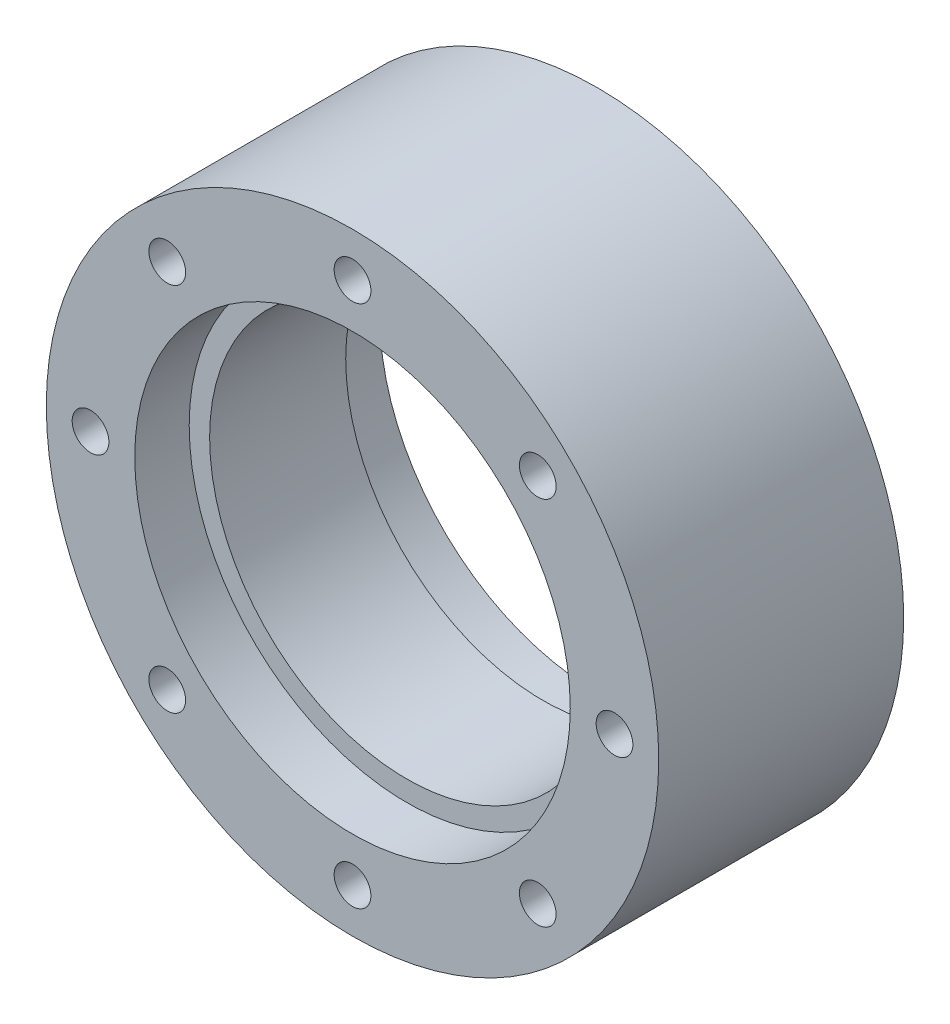
ISO-10303-21;
HEADER;
FILE_DESCRIPTION(('STEP AP214'),'2;1');
FILE_NAME('part.step','',(''),(''),'','','');
FILE_SCHEMA(('AUTOMOTIVE_DESIGN { 1 0 10303 214 1 1 1 1 }'));
ENDSEC;
DATA;
#1=APPLICATION_CONTEXT('core data for automotive mechanical design processes');
#2=APPLICATION_PROTOCOL_DEFINITION('international standard','automotive_design',2000,#1);
#3=PRODUCT_CONTEXT('',#1,'mechanical');
#4=PRODUCT('Part','Part','',(#3));
#5=PRODUCT_RELATED_PRODUCT_CATEGORY('part','',(#4));
#6=PRODUCT_DEFINITION_FORMATION('','',#4);
#7=PRODUCT_DEFINITION_CONTEXT('part definition',#1,'design');
#8=PRODUCT_DEFINITION('design','',#6,#7);
#9=PRODUCT_DEFINITION_SHAPE('','',#8);
#10=(LENGTH_UNIT() NAMED_UNIT(*) SI_UNIT(.MILLI.,.METRE.));
#11=(NAMED_UNIT(*) PLANE_ANGLE_UNIT() SI_UNIT($,.RADIAN.));
#12=(NAMED_UNIT(*) SI_UNIT($,.STERADIAN.) SOLID_ANGLE_UNIT());
#13=UNCERTAINTY_MEASURE_WITH_UNIT(LENGTH_MEASURE(1.E-05),#10,'distance_accuracy_value','');
#14=(GEOMETRIC_REPRESENTATION_CONTEXT(3) GLOBAL_UNCERTAINTY_ASSIGNED_CONTEXT((#13)) GLOBAL_UNIT_ASSIGNED_CONTEXT((#10,
#11,#12)) REPRESENTATION_CONTEXT('',''));
#15=CARTESIAN_POINT('',(0.,0.,0.));
#16=DIRECTION('',(0.,0.,1.));
#17=DIRECTION('',(1.,0.,0.));
#18=AXIS2_PLACEMENT_3D('',#15,#16,#17);
#19=CARTESIAN_POINT('',(0.,19.25,-9.));
#20=DIRECTION('',(0.,0.,1.));
#21=DIRECTION('',(1.,0.,0.));
#22=AXIS2_PLACEMENT_3D('',#19,#20,#21);
#23=CYLINDRICAL_SURFACE('',#22,1.35);
#24=CARTESIAN_POINT('',(0.,19.25,-6.40000000000001));
#25=DIRECTION('',(0.,0.,-1.));
#26=DIRECTION('',(-1.,0.,0.));
#27=AXIS2_PLACEMENT_3D('',#24,#25,#26);
#28=CIRCLE('',#27,1.35);
#29=CARTESIAN_POINT('',(-1.35,19.25,-6.40000000000001));
#30=VERTEX_POINT('',#29);
#31=EDGE_CURVE('E10',#30,#30,#28,.T.);
#32=ORIENTED_EDGE('',*,*,#31,.T.);
#33=EDGE_LOOP('',(#32));
#34=FACE_BOUND('',#33,.T.);
#35=CARTESIAN_POINT('',(0.,19.25,9.00000000000001));
#36=DIRECTION('',(0.,0.,1.));
#37=DIRECTION('',(1.,0.,0.));
#38=AXIS2_PLACEMENT_3D('',#35,#36,#37);
#39=CIRCLE('',#38,1.35);
#40=CARTESIAN_POINT('',(1.35,19.25,9.00000000000001));
#41=VERTEX_POINT('',#40);
#42=EDGE_CURVE('E93',#41,#41,#39,.T.);
#43=ORIENTED_EDGE('',*,*,#42,.T.);
#44=EDGE_LOOP('',(#43));
#45=FACE_BOUND('',#44,.T.);
#46=ADVANCED_FACE('F41',(#34,#45),#23,.F.);
#47=CARTESIAN_POINT('',(16.,0.,-9.));
#48=DIRECTION('',(0.,0.,-1.));
#49=DIRECTION('',(-1.,0.,0.));
#50=AXIS2_PLACEMENT_3D('',#47,#48,#49);
#51=PLANE('',#50);
#52=CARTESIAN_POINT('',(13.611805537841,-13.6118055378411,-9.));
#53=DIRECTION('',(0.,0.,1.));
#54=DIRECTION('',(-0.707106781186551,-0.707106781186544,0.));
#55=AXIS2_PLACEMENT_3D('',#52,#53,#54);
#56=CIRCLE('',#55,1.35);
#57=CARTESIAN_POINT('',(12.6572113832391,-14.5663996924429,-9.));
#58=VERTEX_POINT('',#57);
#59=EDGE_CURVE('E369',#58,#58,#56,.T.);
#60=ORIENTED_EDGE('',*,*,#59,.T.);
#61=EDGE_LOOP('',(#60));
#62=FACE_BOUND('',#61,.T.);
#63=CARTESIAN_POINT('',(-13.6118055378412,-13.6118055378409,-9.));
#64=DIRECTION('',(0.,0.,1.));
#65=DIRECTION('',(-0.707106781186541,0.707106781186554,0.));
#66=AXIS2_PLACEMENT_3D('',#63,#64,#65);
#67=CIRCLE('',#66,1.35);
#68=CARTESIAN_POINT('',(-14.566399692443,-12.6572113832391,-9.));
#69=VERTEX_POINT('',#68);
#70=EDGE_CURVE('E379',#69,#69,#67,.T.);
#71=ORIENTED_EDGE('',*,*,#70,.T.);
#72=EDGE_LOOP('',(#71));
#73=FACE_BOUND('',#72,.T.);
#74=CARTESIAN_POINT('',(-13.6118055378409,13.6118055378412,-9.));
#75=DIRECTION('',(0.,0.,1.));
#76=DIRECTION('',(0.707106781186556,0.707106781186539,0.));
#77=AXIS2_PLACEMENT_3D('',#74,#75,#76);
#78=CIRCLE('',#77,1.35);
#79=CARTESIAN_POINT('',(-12.657211383239,14.566399692443,-9.));
#80=VERTEX_POINT('',#79);
#81=EDGE_CURVE('E430',#80,#80,#78,.T.);
#82=ORIENTED_EDGE('',*,*,#81,.T.);
#83=EDGE_LOOP('',(#82));
#84=FACE_BOUND('',#83,.T.);
#85=CARTESIAN_POINT('',(13.6118055378411,13.611805537841,-9.));
#86=DIRECTION('',(0.,0.,1.));
#87=DIRECTION('',(0.707106781186546,-0.707106781186549,0.));
#88=AXIS2_PLACEMENT_3D('',#85,#86,#87);
#89=CIRCLE('',#88,1.35);
#90=CARTESIAN_POINT('',(14.5663996924429,12.6572113832392,-9.));
#91=VERTEX_POINT('',#90);
#92=EDGE_CURVE('E73',#91,#91,#89,.T.);
#93=ORIENTED_EDGE('',*,*,#92,.T.);
#94=EDGE_LOOP('',(#93));
#95=FACE_BOUND('',#94,.T.);
#96=CARTESIAN_POINT('',(19.25,0.,-9.));
#97=DIRECTION('',(0.,0.,-1.));
#98=DIRECTION('',(-1.,0.,0.));
#99=AXIS2_PLACEMENT_3D('',#96,#97,#98);
#100=CIRCLE('',#99,2.24999999999999);
#101=CARTESIAN_POINT('',(21.5,0.,-9.));
#102=VERTEX_POINT('',#101);
#103=EDGE_CURVE('E66',#102,#102,#100,.F.);
#104=ORIENTED_EDGE('',*,*,#103,.T.);
#105=EDGE_LOOP('',(#104));
#106=FACE_BOUND('',#105,.T.);
#107=CARTESIAN_POINT('',(0.,-19.25,-9.));
#108=DIRECTION('',(0.,0.,-1.));
#109=DIRECTION('',(-1.,0.,0.));
#110=AXIS2_PLACEMENT_3D('',#107,#108,#109);
#111=CIRCLE('',#110,2.24999999999999);
#112=CARTESIAN_POINT('',(2.24999999999999,-19.25,-9.));
#113=VERTEX_POINT('',#112);
#114=EDGE_CURVE('E62',#113,#113,#111,.F.);
#115=ORIENTED_EDGE('',*,*,#114,.T.);
#116=EDGE_LOOP('',(#115));
#117=FACE_BOUND('',#116,.T.);
#118=CARTESIAN_POINT('',(-19.25,2.01633047318191E-13,-9.));
#119=DIRECTION('',(0.,0.,-1.));
#120=DIRECTION('',(-1.,0.,0.));
#121=AXIS2_PLACEMENT_3D('',#118,#119,#120);
#122=CIRCLE('',#121,2.24999999999999);
#123=CARTESIAN_POINT('',(-17.,2.01633047318191E-13,-9.));
#124=VERTEX_POINT('',#123);
#125=EDGE_CURVE('E59',#124,#124,#122,.F.);
#126=ORIENTED_EDGE('',*,*,#125,.T.);
#127=EDGE_LOOP('',(#126));
#128=FACE_BOUND('',#127,.T.);
#129=CARTESIAN_POINT('',(0.,19.25,-9.));
#130=DIRECTION('',(0.,0.,-1.));
#131=DIRECTION('',(-1.,0.,0.));
#132=AXIS2_PLACEMENT_3D('',#129,#130,#131);
#133=CIRCLE('',#132,2.24999999999999);
#134=CARTESIAN_POINT('',(2.24999999999999,19.25,-9.));
#135=VERTEX_POINT('',#134);
#136=EDGE_CURVE('E92',#135,#135,#133,.F.);
#137=ORIENTED_EDGE('',*,*,#136,.T.);
#138=EDGE_LOOP('',(#137));
#139=FACE_BOUND('',#138,.T.);
#140=CARTESIAN_POINT('',(0.,0.,-9.));
#141=DIRECTION('',(0.,0.,1.));
#142=DIRECTION('',(1.,0.,0.));
#143=AXIS2_PLACEMENT_3D('',#140,#141,#142);
#144=CIRCLE('',#143,16.);
#145=CARTESIAN_POINT('',(16.,0.,-9.));
#146=VERTEX_POINT('',#145);
#147=EDGE_CURVE('E96',#146,#146,#144,.T.);
#148=ORIENTED_EDGE('',*,*,#147,.T.);
#149=EDGE_LOOP('',(#148));
#150=FACE_BOUND('',#149,.T.);
#151=CARTESIAN_POINT('',(0.,0.,-9.));
#152=DIRECTION('',(0.,0.,1.));
#153=DIRECTION('',(1.,0.,0.));
#154=AXIS2_PLACEMENT_3D('',#151,#152,#153);
#155=CIRCLE('',#154,22.5);
#156=CARTESIAN_POINT('',(22.5,0.,-9.));
#157=VERTEX_POINT('',#156);
#158=EDGE_CURVE('E55',#157,#157,#155,.T.);
#159=ORIENTED_EDGE('',*,*,#158,.F.);
#160=EDGE_LOOP('',(#159));
#161=FACE_BOUND('',#160,.T.);
#162=ADVANCED_FACE('F121',(#62,#73,#84,#95,#106,#117,#128,#139,#150,#161),#51,.T.);
#163=CARTESIAN_POINT('',(0.,0.,9.9));
#164=DIRECTION('',(0.,0.,1.));
#165=DIRECTION('',(1.,0.,0.));
#166=AXIS2_PLACEMENT_3D('',#163,#164,#165);
#167=CYLINDRICAL_SURFACE('',#166,22.5);
#168=ORIENTED_EDGE('',*,*,#158,.T.);
#169=EDGE_LOOP('',(#168));
#170=FACE_BOUND('',#169,.T.);
#171=CARTESIAN_POINT('',(0.,0.,9.));
#172=DIRECTION('',(0.,0.,1.));
#173=DIRECTION('',(1.,0.,0.));
#174=AXIS2_PLACEMENT_3D('',#171,#172,#173);
#175=CIRCLE('',#174,22.5);
#176=CARTESIAN_POINT('',(22.5,0.,9.));
#177=VERTEX_POINT('',#176);
#178=EDGE_CURVE('E114',#177,#177,#175,.T.);
#179=ORIENTED_EDGE('',*,*,#178,.F.);
#180=EDGE_LOOP('',(#179));
#181=FACE_BOUND('',#180,.T.);
#182=ADVANCED_FACE('F148',(#170,#181),#167,.T.);
#183=CARTESIAN_POINT('',(22.5,0.,9.));
#184=DIRECTION('',(0.,0.,1.));
#185=DIRECTION('',(1.,0.,0.));
#186=AXIS2_PLACEMENT_3D('',#183,#184,#185);
#187=PLANE('',#186);
#188=CARTESIAN_POINT('',(19.25,0.,9.00000000000001));
#189=DIRECTION('',(0.,0.,1.));
#190=DIRECTION('',(0.,-1.,0.));
#191=AXIS2_PLACEMENT_3D('',#188,#189,#190);
#192=CIRCLE('',#191,1.35);
#193=CARTESIAN_POINT('',(19.25,-1.35000000000007,9.00000000000001));
#194=VERTEX_POINT('',#193);
#195=EDGE_CURVE('E376',#194,#194,#192,.T.);
#196=ORIENTED_EDGE('',*,*,#195,.F.);
#197=EDGE_LOOP('',(#196));
#198=FACE_BOUND('',#197,.T.);
#199=CARTESIAN_POINT('',(13.611805537841,-13.6118055378411,9.00000000000001));
#200=DIRECTION('',(0.,0.,1.));
#201=DIRECTION('',(-0.707106781186551,-0.707106781186544,0.));
#202=AXIS2_PLACEMENT_3D('',#199,#200,#201);
#203=CIRCLE('',#202,1.35);
#204=CARTESIAN_POINT('',(12.6572113832391,-14.5663996924429,9.00000000000001));
#205=VERTEX_POINT('',#204);
#206=EDGE_CURVE('E372',#205,#205,#203,.T.);
#207=ORIENTED_EDGE('',*,*,#206,.F.);
#208=EDGE_LOOP('',(#207));
#209=FACE_BOUND('',#208,.T.);
#210=CARTESIAN_POINT('',(0.,-19.25,9.00000000000001));
#211=DIRECTION('',(0.,0.,1.));
#212=DIRECTION('',(-1.,0.,0.));
#213=AXIS2_PLACEMENT_3D('',#210,#211,#212);
#214=CIRCLE('',#213,1.35);
#215=CARTESIAN_POINT('',(-1.35,-19.25,9.00000000000001));
#216=VERTEX_POINT('',#215);
#217=EDGE_CURVE('E374',#216,#216,#214,.T.);
#218=ORIENTED_EDGE('',*,*,#217,.F.);
#219=EDGE_LOOP('',(#218));
#220=FACE_BOUND('',#219,.T.);
#221=CARTESIAN_POINT('',(-13.6118055378412,-13.6118055378409,9.00000000000001));
#222=DIRECTION('',(0.,0.,1.));
#223=DIRECTION('',(-0.707106781186541,0.707106781186554,0.));
#224=AXIS2_PLACEMENT_3D('',#221,#222,#223);
#225=CIRCLE('',#224,1.35);
#226=CARTESIAN_POINT('',(-14.566399692443,-12.6572113832391,9.00000000000001));
#227=VERTEX_POINT('',#226);
#228=EDGE_CURVE('E384',#227,#227,#225,.T.);
#229=ORIENTED_EDGE('',*,*,#228,.F.);
#230=EDGE_LOOP('',(#229));
#231=FACE_BOUND('',#230,.T.);
#232=CARTESIAN_POINT('',(-19.25,2.01633047318191E-13,9.00000000000001));
#233=DIRECTION('',(0.,0.,1.));
#234=DIRECTION('',(0.,1.,0.));
#235=AXIS2_PLACEMENT_3D('',#232,#233,#234);
#236=CIRCLE('',#235,1.35);
#237=CARTESIAN_POINT('',(-19.25,1.3500000000002,9.00000000000001));
#238=VERTEX_POINT('',#237);
#239=EDGE_CURVE('E387',#238,#238,#236,.T.);
#240=ORIENTED_EDGE('',*,*,#239,.F.);
#241=EDGE_LOOP('',(#240));
#242=FACE_BOUND('',#241,.T.);
#243=CARTESIAN_POINT('',(-13.6118055378409,13.6118055378412,9.00000000000001));
#244=DIRECTION('',(0.,0.,1.));
#245=DIRECTION('',(0.707106781186556,0.707106781186539,0.));
#246=AXIS2_PLACEMENT_3D('',#243,#244,#245);
#247=CIRCLE('',#246,1.35);
#248=CARTESIAN_POINT('',(-12.657211383239,14.566399692443,9.00000000000001));
#249=VERTEX_POINT('',#248);
#250=EDGE_CURVE('E428',#249,#249,#247,.T.);
#251=ORIENTED_EDGE('',*,*,#250,.F.);
#252=EDGE_LOOP('',(#251));
#253=FACE_BOUND('',#252,.T.);
#254=CARTESIAN_POINT('',(13.6118055378411,13.611805537841,9.00000000000001));
#255=DIRECTION('',(0.,0.,1.));
#256=DIRECTION('',(0.707106781186546,-0.707106781186549,0.));
#257=AXIS2_PLACEMENT_3D('',#254,#255,#256);
#258=CIRCLE('',#257,1.35);
#259=CARTESIAN_POINT('',(14.5663996924429,12.6572113832392,9.00000000000001));
#260=VERTEX_POINT('',#259);
#261=EDGE_CURVE('E390',#260,#260,#258,.T.);
#262=ORIENTED_EDGE('',*,*,#261,.F.);
#263=EDGE_LOOP('',(#262));
#264=FACE_BOUND('',#263,.T.);
#265=ORIENTED_EDGE('',*,*,#42,.F.);
#266=EDGE_LOOP('',(#265));
#267=FACE_BOUND('',#266,.T.);
#268=ORIENTED_EDGE('',*,*,#178,.T.);
#269=EDGE_LOOP('',(#268));
#270=FACE_BOUND('',#269,.T.);
#271=CARTESIAN_POINT('',(0.,0.,9.00000000000001));
#272=DIRECTION('',(0.,0.,1.));
#273=DIRECTION('',(1.,0.,0.));
#274=AXIS2_PLACEMENT_3D('',#271,#272,#273);
#275=CIRCLE('',#274,16.);
#276=CARTESIAN_POINT('',(16.,0.,9.00000000000001));
#277=VERTEX_POINT('',#276);
#278=EDGE_CURVE('E111',#277,#277,#275,.T.);
#279=ORIENTED_EDGE('',*,*,#278,.F.);
#280=EDGE_LOOP('',(#279));
#281=FACE_BOUND('',#280,.T.);
#282=ADVANCED_FACE('F166',(#198,#209,#220,#231,#242,#253,#264,#267,#270,#281),#187,.T.);
#283=CARTESIAN_POINT('',(0.,0.,9.9));
#284=DIRECTION('',(0.,0.,1.));
#285=DIRECTION('',(1.,0.,0.));
#286=AXIS2_PLACEMENT_3D('',#283,#284,#285);
#287=CYLINDRICAL_SURFACE('',#286,16.);
#288=ORIENTED_EDGE('',*,*,#278,.T.);
#289=EDGE_LOOP('',(#288));
#290=FACE_BOUND('',#289,.T.);
#291=CARTESIAN_POINT('',(0.,0.,5.));
#292=DIRECTION('',(0.,0.,1.));
#293=DIRECTION('',(1.,0.,0.));
#294=AXIS2_PLACEMENT_3D('',#291,#292,#293);
#295=CIRCLE('',#294,16.);
#296=CARTESIAN_POINT('',(16.,0.,5.));
#297=VERTEX_POINT('',#296);
#298=EDGE_CURVE('E108',#297,#297,#295,.T.);
#299=ORIENTED_EDGE('',*,*,#298,.F.);
#300=EDGE_LOOP('',(#299));
#301=FACE_BOUND('',#300,.T.);
#302=ADVANCED_FACE('F162',(#290,#301),#287,.F.);
#303=CARTESIAN_POINT('',(16.,0.,5.));
#304=DIRECTION('',(0.,0.,1.));
#305=DIRECTION('',(1.,0.,0.));
#306=AXIS2_PLACEMENT_3D('',#303,#304,#305);
#307=PLANE('',#306);
#308=ORIENTED_EDGE('',*,*,#298,.T.);
#309=EDGE_LOOP('',(#308));
#310=FACE_BOUND('',#309,.T.);
#311=CARTESIAN_POINT('',(0.,0.,5.));
#312=DIRECTION('',(0.,0.,1.));
#313=DIRECTION('',(1.,0.,0.));
#314=AXIS2_PLACEMENT_3D('',#311,#312,#313);
#315=CIRCLE('',#314,14.5);
#316=CARTESIAN_POINT('',(14.5,0.,5.));
#317=VERTEX_POINT('',#316);
#318=EDGE_CURVE('E105',#317,#317,#315,.T.);
#319=ORIENTED_EDGE('',*,*,#318,.F.);
#320=EDGE_LOOP('',(#319));
#321=FACE_BOUND('',#320,.T.);
#322=ADVANCED_FACE('F158',(#310,#321),#307,.T.);
#323=CARTESIAN_POINT('',(0.,0.,9.9));
#324=DIRECTION('',(0.,0.,1.));
#325=DIRECTION('',(1.,0.,0.));
#326=AXIS2_PLACEMENT_3D('',#323,#324,#325);
#327=CYLINDRICAL_SURFACE('',#326,14.5);
#328=ORIENTED_EDGE('',*,*,#318,.T.);
#329=EDGE_LOOP('',(#328));
#330=FACE_BOUND('',#329,.T.);
#331=CARTESIAN_POINT('',(0.,0.,-5.));
#332=DIRECTION('',(0.,0.,1.));
#333=DIRECTION('',(1.,0.,0.));
#334=AXIS2_PLACEMENT_3D('',#331,#332,#333);
#335=CIRCLE('',#334,14.5);
#336=CARTESIAN_POINT('',(14.5,0.,-5.));
#337=VERTEX_POINT('',#336);
#338=EDGE_CURVE('E102',#337,#337,#335,.T.);
#339=ORIENTED_EDGE('',*,*,#338,.F.);
#340=EDGE_LOOP('',(#339));
#341=FACE_BOUND('',#340,.T.);
#342=ADVANCED_FACE('F154',(#330,#341),#327,.F.);
#343=CARTESIAN_POINT('',(16.,0.,-5.));
#344=DIRECTION('',(0.,0.,-1.));
#345=DIRECTION('',(-1.,0.,0.));
#346=AXIS2_PLACEMENT_3D('',#343,#344,#345);
#347=PLANE('',#346);
#348=ORIENTED_EDGE('',*,*,#338,.T.);
#349=EDGE_LOOP('',(#348));
#350=FACE_BOUND('',#349,.T.);
#351=CARTESIAN_POINT('',(0.,0.,-5.));
#352=DIRECTION('',(0.,0.,1.));
#353=DIRECTION('',(1.,0.,0.));
#354=AXIS2_PLACEMENT_3D('',#351,#352,#353);
#355=CIRCLE('',#354,16.);
#356=CARTESIAN_POINT('',(16.,0.,-5.));
#357=VERTEX_POINT('',#356);
#358=EDGE_CURVE('E99',#357,#357,#355,.T.);
#359=ORIENTED_EDGE('',*,*,#358,.F.);
#360=EDGE_LOOP('',(#359));
#361=FACE_BOUND('',#360,.T.);
#362=ADVANCED_FACE('F140',(#350,#361),#347,.T.);
#363=CARTESIAN_POINT('',(0.,0.,9.9));
#364=DIRECTION('',(0.,0.,1.));
#365=DIRECTION('',(1.,0.,0.));
#366=AXIS2_PLACEMENT_3D('',#363,#364,#365);
#367=CYLINDRICAL_SURFACE('',#366,16.);
#368=ORIENTED_EDGE('',*,*,#358,.T.);
#369=EDGE_LOOP('',(#368));
#370=FACE_BOUND('',#369,.T.);
#371=ORIENTED_EDGE('',*,*,#147,.F.);
#372=EDGE_LOOP('',(#371));
#373=FACE_BOUND('',#372,.T.);
#374=ADVANCED_FACE('F132',(#370,#373),#367,.F.);
#375=CARTESIAN_POINT('',(0.,19.25,-6.5));
#376=DIRECTION('',(0.,0.,-1.));
#377=DIRECTION('',(-1.,0.,0.));
#378=AXIS2_PLACEMENT_3D('',#375,#376,#377);
#379=PLANE('',#378);
#380=CARTESIAN_POINT('',(0.,19.25,-6.5));
#381=DIRECTION('',(0.,0.,-1.));
#382=DIRECTION('',(-1.,0.,0.));
#383=AXIS2_PLACEMENT_3D('',#380,#381,#382);
#384=CIRCLE('',#383,1.44999999999999);
#385=CARTESIAN_POINT('',(-1.44999999999999,19.25,-6.5));
#386=VERTEX_POINT('',#385);
#387=EDGE_CURVE('E50',#386,#386,#384,.F.);
#388=ORIENTED_EDGE('',*,*,#387,.T.);
#389=EDGE_LOOP('',(#388));
#390=FACE_BOUND('',#389,.T.);
#391=CARTESIAN_POINT('',(0.,19.25,-6.5));
#392=DIRECTION('',(0.,0.,-1.));
#393=DIRECTION('',(-1.,0.,0.));
#394=AXIS2_PLACEMENT_3D('',#391,#392,#393);
#395=CIRCLE('',#394,2.24999999999999);
#396=CARTESIAN_POINT('',(2.24999999999999,19.25,-6.5));
#397=VERTEX_POINT('',#396);
#398=EDGE_CURVE('E69',#397,#397,#395,.T.);
#399=ORIENTED_EDGE('',*,*,#398,.T.);
#400=EDGE_LOOP('',(#399));
#401=FACE_BOUND('',#400,.T.);
#402=ADVANCED_FACE('F127',(#390,#401),#379,.T.);
#403=CARTESIAN_POINT('',(0.,19.25,-9.000012));
#404=DIRECTION('',(0.,0.,1.));
#405=DIRECTION('',(1.,0.,0.));
#406=AXIS2_PLACEMENT_3D('',#403,#404,#405);
#407=CYLINDRICAL_SURFACE('',#406,2.24999999999999);
#408=CARTESIAN_POINT('',(2.24999999999999,19.25,-9.));
#409=CARTESIAN_POINT('',(2.24999999999999,19.25,-8.97395833333333));
#410=CARTESIAN_POINT('',(2.24999999999999,19.25,-8.94791666666667));
#411=CARTESIAN_POINT('',(2.24999999999999,19.25,-8.89583333333333));
#412=CARTESIAN_POINT('',(2.24999999999999,19.25,-8.86979166666667));
#413=CARTESIAN_POINT('',(2.24999999999999,19.25,-8.81770833333333));
#414=CARTESIAN_POINT('',(2.24999999999999,19.25,-8.79166666666667));
#415=CARTESIAN_POINT('',(2.24999999999999,19.25,-8.73958333333333));
#416=CARTESIAN_POINT('',(2.24999999999999,19.25,-8.71354166666667));
#417=CARTESIAN_POINT('',(2.24999999999999,19.25,-8.66145833333333));
#418=CARTESIAN_POINT('',(2.24999999999999,19.25,-8.63541666666667));
#419=CARTESIAN_POINT('',(2.24999999999999,19.25,-8.58333333333333));
#420=CARTESIAN_POINT('',(2.24999999999999,19.25,-8.55729166666667));
#421=CARTESIAN_POINT('',(2.24999999999999,19.25,-8.50520833333333));
#422=CARTESIAN_POINT('',(2.24999999999999,19.25,-8.47916666666667));
#423=CARTESIAN_POINT('',(2.24999999999999,19.25,-8.42708333333333));
#424=CARTESIAN_POINT('',(2.24999999999999,19.25,-8.40104166666667));
#425=CARTESIAN_POINT('',(2.24999999999999,19.25,-8.34895833333333));
#426=CARTESIAN_POINT('',(2.24999999999999,19.25,-8.32291666666667));
#427=CARTESIAN_POINT('',(2.24999999999999,19.25,-8.27083333333333));
#428=CARTESIAN_POINT('',(2.24999999999999,19.25,-8.24479166666667));
#429=CARTESIAN_POINT('',(2.24999999999999,19.25,-8.19270833333333));
#430=CARTESIAN_POINT('',(2.24999999999999,19.25,-8.16666666666667));
#431=CARTESIAN_POINT('',(2.24999999999999,19.25,-8.11458333333333));
#432=CARTESIAN_POINT('',(2.24999999999999,19.25,-8.08854166666667));
#433=CARTESIAN_POINT('',(2.24999999999999,19.25,-8.03645833333333));
#434=CARTESIAN_POINT('',(2.24999999999999,19.25,-8.01041666666667));
#435=CARTESIAN_POINT('',(2.24999999999999,19.25,-7.95833333333333));
#436=CARTESIAN_POINT('',(2.24999999999999,19.25,-7.93229166666667));
#437=CARTESIAN_POINT('',(2.24999999999999,19.25,-7.88020833333333));
#438=CARTESIAN_POINT('',(2.24999999999999,19.25,-7.85416666666667));
#439=CARTESIAN_POINT('',(2.24999999999999,19.25,-7.80208333333333));
#440=CARTESIAN_POINT('',(2.24999999999999,19.25,-7.77604166666667));
#441=CARTESIAN_POINT('',(2.24999999999999,19.25,-7.72395833333333));
#442=CARTESIAN_POINT('',(2.24999999999999,19.25,-7.69791666666667));
#443=CARTESIAN_POINT('',(2.24999999999999,19.25,-7.64583333333333));
#444=CARTESIAN_POINT('',(2.24999999999999,19.25,-7.61979166666667));
#445=CARTESIAN_POINT('',(2.24999999999999,19.25,-7.56770833333333));
#446=CARTESIAN_POINT('',(2.24999999999999,19.25,-7.54166666666667));
#447=CARTESIAN_POINT('',(2.24999999999999,19.25,-7.48958333333333));
#448=CARTESIAN_POINT('',(2.24999999999999,19.25,-7.46354166666667));
#449=CARTESIAN_POINT('',(2.24999999999999,19.25,-7.41145833333333));
#450=CARTESIAN_POINT('',(2.24999999999999,19.25,-7.38541666666667));
#451=CARTESIAN_POINT('',(2.24999999999999,19.25,-7.33333333333333));
#452=CARTESIAN_POINT('',(2.24999999999999,19.25,-7.30729166666667));
#453=CARTESIAN_POINT('',(2.24999999999999,19.25,-7.25520833333333));
#454=CARTESIAN_POINT('',(2.24999999999999,19.25,-7.22916666666667));
#455=CARTESIAN_POINT('',(2.24999999999999,19.25,-7.17708333333333));
#456=CARTESIAN_POINT('',(2.24999999999999,19.25,-7.15104166666667));
#457=CARTESIAN_POINT('',(2.24999999999999,19.25,-7.09895833333333));
#458=CARTESIAN_POINT('',(2.24999999999999,19.25,-7.07291666666667));
#459=CARTESIAN_POINT('',(2.24999999999999,19.25,-7.02083333333333));
#460=CARTESIAN_POINT('',(2.24999999999999,19.25,-6.99479166666667));
#461=CARTESIAN_POINT('',(2.24999999999999,19.25,-6.94270833333333));
#462=CARTESIAN_POINT('',(2.24999999999999,19.25,-6.91666666666667));
#463=CARTESIAN_POINT('',(2.24999999999999,19.25,-6.86458333333333));
#464=CARTESIAN_POINT('',(2.24999999999999,19.25,-6.83854166666667));
#465=CARTESIAN_POINT('',(2.24999999999999,19.25,-6.78645833333333));
#466=CARTESIAN_POINT('',(2.24999999999999,19.25,-6.76041666666667));
#467=CARTESIAN_POINT('',(2.24999999999999,19.25,-6.70833333333333));
#468=CARTESIAN_POINT('',(2.24999999999999,19.25,-6.68229166666667));
#469=CARTESIAN_POINT('',(2.24999999999999,19.25,-6.63020833333333));
#470=CARTESIAN_POINT('',(2.24999999999999,19.25,-6.60416666666667));
#471=CARTESIAN_POINT('',(2.24999999999999,19.25,-6.55208333333333));
#472=CARTESIAN_POINT('',(2.24999999999999,19.25,-6.52604166666667));
#473=CARTESIAN_POINT('',(2.24999999999999,19.25,-6.5));
#474=B_SPLINE_CURVE_WITH_KNOTS('',3,(#408,#409,#410,#411,#412,#413,#414,#415,#416,#417,#418,
#419,#420,#421,#422,#423,#424,#425,#426,#427,#428,#429,#430,#431,#432,#433,#434,#435,#436,#437,
#438,#439,#440,#441,#442,#443,#444,#445,#446,#447,#448,#449,#450,#451,#452,#453,#454,#455,#456,
#457,#458,#459,#460,#461,#462,#463,#464,#465,#466,#467,#468,#469,#470,#471,#472,#473),
.UNSPECIFIED.,.F.,.F.,(4,2,2,2,2,2,2,2,2,2,2,2,2,2,2,2,2,2,2,2,2,2,2,2,2,2,2,2,2,2,2,2,4),(0.,
0.0781249999999983,0.156249999999998,0.234374999999998,0.312499999999999,0.390624999999999,
0.468749999999999,0.546874999999999,0.624999999999999,0.703124999999999,0.781249999999999,
0.859374999999999,0.937499999999999,1.015625,1.09375,1.171875,1.25,1.328125,1.40625,1.484375,
1.5625,1.640625,1.71875,1.796875,1.875,1.953125,2.03125,2.109375,2.1875,2.265625,2.34375,
2.421875,2.5),.UNSPECIFIED.);
#475=EDGE_CURVE('BSEAM124',#135,#397,#474,.T.);
#476=ORIENTED_EDGE('',*,*,#136,.F.);
#477=ORIENTED_EDGE('',*,*,#398,.F.);
#478=ORIENTED_EDGE('',*,*,#475,.T.);
#479=ORIENTED_EDGE('',*,*,#475,.F.);
#480=EDGE_LOOP('',(#476,#478,#477,#479));
#481=FACE_BOUND('',#480,.T.);
#482=ADVANCED_FACE('F124',(#481),#407,.F.);
#483=CARTESIAN_POINT('',(0.,19.25,-6.5));
#484=DIRECTION('',(0.,0.,-1.));
#485=DIRECTION('',(-1.,0.,0.));
#486=AXIS2_PLACEMENT_3D('',#483,#484,#485);
#487=CONICAL_SURFACE('',#486,1.44999999999999,0.785398163397449);
#488=ORIENTED_EDGE('',*,*,#31,.F.);
#489=EDGE_LOOP('',(#488));
#490=FACE_BOUND('',#489,.T.);
#491=ORIENTED_EDGE('',*,*,#387,.F.);
#492=EDGE_LOOP('',(#491));
#493=FACE_BOUND('',#492,.T.);
#494=ADVANCED_FACE('F44',(#490,#493),#487,.F.);
#495=CARTESIAN_POINT('',(-19.25,2.01633047318191E-13,-9.000012));
#496=DIRECTION('',(0.,0.,1.));
#497=DIRECTION('',(1.,0.,0.));
#498=AXIS2_PLACEMENT_3D('',#495,#496,#497);
#499=CYLINDRICAL_SURFACE('',#498,2.24999999999999);
#500=CARTESIAN_POINT('',(-19.25,2.01633047318191E-13,-6.5));
#501=DIRECTION('',(0.,0.,-1.));
#502=DIRECTION('',(0.,-1.,0.));
#503=AXIS2_PLACEMENT_3D('',#500,#501,#502);
#504=CIRCLE('',#503,2.24999999999999);
#505=CARTESIAN_POINT('',(-17.,2.01633047318191E-13,-6.5));
#506=VERTEX_POINT('',#505);
#507=EDGE_CURVE('E78',#506,#506,#504,.T.);
#508=CARTESIAN_POINT('',(-17.,2.01633047318191E-13,-9.));
#509=CARTESIAN_POINT('',(-17.,2.01633047318191E-13,-8.97395833333333));
#510=CARTESIAN_POINT('',(-17.,2.01633047318191E-13,-8.94791666666667));
#511=CARTESIAN_POINT('',(-17.,2.01633047318191E-13,-8.89583333333333));
#512=CARTESIAN_POINT('',(-17.,2.01633047318191E-13,-8.86979166666667));
#513=CARTESIAN_POINT('',(-17.,2.01633047318191E-13,-8.81770833333333));
#514=CARTESIAN_POINT('',(-17.,2.01633047318191E-13,-8.79166666666667));
#515=CARTESIAN_POINT('',(-17.,2.01633047318191E-13,-8.73958333333333));
#516=CARTESIAN_POINT('',(-17.,2.01633047318191E-13,-8.71354166666667));
#517=CARTESIAN_POINT('',(-17.,2.01633047318191E-13,-8.66145833333333));
#518=CARTESIAN_POINT('',(-17.,2.01633047318191E-13,-8.63541666666667));
#519=CARTESIAN_POINT('',(-17.,2.01633047318191E-13,-8.58333333333333));
#520=CARTESIAN_POINT('',(-17.,2.01633047318191E-13,-8.55729166666667));
#521=CARTESIAN_POINT('',(-17.,2.01633047318191E-13,-8.50520833333333));
#522=CARTESIAN_POINT('',(-17.,2.01633047318191E-13,-8.47916666666667));
#523=CARTESIAN_POINT('',(-17.,2.01633047318191E-13,-8.42708333333333));
#524=CARTESIAN_POINT('',(-17.,2.01633047318191E-13,-8.40104166666667));
#525=CARTESIAN_POINT('',(-17.,2.01633047318191E-13,-8.34895833333333));
#526=CARTESIAN_POINT('',(-17.,2.01633047318191E-13,-8.32291666666667));
#527=CARTESIAN_POINT('',(-17.,2.01633047318191E-13,-8.27083333333333));
#528=CARTESIAN_POINT('',(-17.,2.01633047318191E-13,-8.24479166666667));
#529=CARTESIAN_POINT('',(-17.,2.01633047318191E-13,-8.19270833333333));
#530=CARTESIAN_POINT('',(-17.,2.01633047318191E-13,-8.16666666666667));
#531=CARTESIAN_POINT('',(-17.,2.01633047318191E-13,-8.11458333333333));
#532=CARTESIAN_POINT('',(-17.,2.01633047318191E-13,-8.08854166666667));
#533=CARTESIAN_POINT('',(-17.,2.01633047318191E-13,-8.03645833333333));
#534=CARTESIAN_POINT('',(-17.,2.01633047318191E-13,-8.01041666666667));
#535=CARTESIAN_POINT('',(-17.,2.01633047318191E-13,-7.95833333333333));
#536=CARTESIAN_POINT('',(-17.,2.01633047318191E-13,-7.93229166666667));
#537=CARTESIAN_POINT('',(-17.,2.01633047318191E-13,-7.88020833333333));
#538=CARTESIAN_POINT('',(-17.,2.01633047318191E-13,-7.85416666666667));
#539=CARTESIAN_POINT('',(-17.,2.01633047318191E-13,-7.80208333333333));
#540=CARTESIAN_POINT('',(-17.,2.01633047318191E-13,-7.77604166666667));
#541=CARTESIAN_POINT('',(-17.,2.01633047318191E-13,-7.72395833333333));
#542=CARTESIAN_POINT('',(-17.,2.01633047318191E-13,-7.69791666666667));
#543=CARTESIAN_POINT('',(-17.,2.01633047318191E-13,-7.64583333333333));
#544=CARTESIAN_POINT('',(-17.,2.01633047318191E-13,-7.61979166666667));
#545=CARTESIAN_POINT('',(-17.,2.01633047318191E-13,-7.56770833333333));
#546=CARTESIAN_POINT('',(-17.,2.01633047318191E-13,-7.54166666666667));
#547=CARTESIAN_POINT('',(-17.,2.01633047318191E-13,-7.48958333333333));
#548=CARTESIAN_POINT('',(-17.,2.01633047318191E-13,-7.46354166666667));
#549=CARTESIAN_POINT('',(-17.,2.01633047318191E-13,-7.41145833333333));
#550=CARTESIAN_POINT('',(-17.,2.01633047318191E-13,-7.38541666666667));
#551=CARTESIAN_POINT('',(-17.,2.01633047318191E-13,-7.33333333333333));
#552=CARTESIAN_POINT('',(-17.,2.01633047318191E-13,-7.30729166666667));
#553=CARTESIAN_POINT('',(-17.,2.01633047318191E-13,-7.25520833333333));
#554=CARTESIAN_POINT('',(-17.,2.01633047318191E-13,-7.22916666666667));
#555=CARTESIAN_POINT('',(-17.,2.01633047318191E-13,-7.17708333333333));
#556=CARTESIAN_POINT('',(-17.,2.01633047318191E-13,-7.15104166666667));
#557=CARTESIAN_POINT('',(-17.,2.01633047318191E-13,-7.09895833333333));
#558=CARTESIAN_POINT('',(-17.,2.01633047318191E-13,-7.07291666666667));
#559=CARTESIAN_POINT('',(-17.,2.01633047318191E-13,-7.02083333333333));
#560=CARTESIAN_POINT('',(-17.,2.01633047318191E-13,-6.99479166666667));
#561=CARTESIAN_POINT('',(-17.,2.01633047318191E-13,-6.94270833333333));
#562=CARTESIAN_POINT('',(-17.,2.01633047318191E-13,-6.91666666666667));
#563=CARTESIAN_POINT('',(-17.,2.01633047318191E-13,-6.86458333333333));
#564=CARTESIAN_POINT('',(-17.,2.01633047318191E-13,-6.83854166666667));
#565=CARTESIAN_POINT('',(-17.,2.01633047318191E-13,-6.78645833333333));
#566=CARTESIAN_POINT('',(-17.,2.01633047318191E-13,-6.76041666666667));
#567=CARTESIAN_POINT('',(-17.,2.01633047318191E-13,-6.70833333333333));
#568=CARTESIAN_POINT('',(-17.,2.01633047318191E-13,-6.68229166666667));
#569=CARTESIAN_POINT('',(-17.,2.01633047318191E-13,-6.63020833333333));
#570=CARTESIAN_POINT('',(-17.,2.01633047318191E-13,-6.60416666666667));
#571=CARTESIAN_POINT('',(-17.,2.01633047318191E-13,-6.55208333333333));
#572=CARTESIAN_POINT('',(-17.,2.01633047318191E-13,-6.52604166666667));
#573=CARTESIAN_POINT('',(-17.,2.01633047318191E-13,-6.5));
#574=B_SPLINE_CURVE_WITH_KNOTS('',3,(#508,#509,#510,#511,#512,#513,#514,#515,#516,#517,#518,
#519,#520,#521,#522,#523,#524,#525,#526,#527,#528,#529,#530,#531,#532,#533,#534,#535,#536,#537,
#538,#539,#540,#541,#542,#543,#544,#545,#546,#547,#548,#549,#550,#551,#552,#553,#554,#555,#556,
#557,#558,#559,#560,#561,#562,#563,#564,#565,#566,#567,#568,#569,#570,#571,#572,#573),
.UNSPECIFIED.,.F.,.F.,(4,2,2,2,2,2,2,2,2,2,2,2,2,2,2,2,2,2,2,2,2,2,2,2,2,2,2,2,2,2,2,2,4),(0.,
0.0781249999999983,0.156249999999998,0.234374999999998,0.312499999999999,0.390624999999999,
0.468749999999999,0.546874999999999,0.624999999999999,0.703124999999999,0.781249999999999,
0.859374999999999,0.937499999999999,1.015625,1.09375,1.171875,1.25,1.328125,1.40625,1.484375,
1.5625,1.640625,1.71875,1.796875,1.875,1.953125,2.03125,2.109375,2.1875,2.265625,2.34375,
2.421875,2.5),.UNSPECIFIED.);
#575=EDGE_CURVE('BSEAM237',#124,#506,#574,.T.);
#576=ORIENTED_EDGE('',*,*,#125,.F.);
#577=ORIENTED_EDGE('',*,*,#507,.F.);
#578=ORIENTED_EDGE('',*,*,#575,.T.);
#579=ORIENTED_EDGE('',*,*,#575,.F.);
#580=EDGE_LOOP('',(#576,#578,#577,#579));
#581=FACE_BOUND('',#580,.T.);
#582=ADVANCED_FACE('F237',(#581),#499,.F.);
#583=CARTESIAN_POINT('',(-19.25,2.01633047318191E-13,-6.5));
#584=DIRECTION('',(0.,0.,-1.));
#585=DIRECTION('',(0.,-1.,0.));
#586=AXIS2_PLACEMENT_3D('',#583,#584,#585);
#587=PLANE('',#586);
#588=CARTESIAN_POINT('',(-19.25,2.01633047318191E-13,-6.5));
#589=DIRECTION('',(0.,0.,-1.));
#590=DIRECTION('',(-1.,0.,0.));
#591=AXIS2_PLACEMENT_3D('',#588,#589,#590);
#592=CIRCLE('',#591,1.35);
#593=CARTESIAN_POINT('',(-20.6,2.01633047318191E-13,-6.5));
#594=VERTEX_POINT('',#593);
#595=EDGE_CURVE('E46',#594,#594,#592,.T.);
#596=ORIENTED_EDGE('',*,*,#595,.F.);
#597=EDGE_LOOP('',(#596));
#598=FACE_BOUND('',#597,.T.);
#599=ORIENTED_EDGE('',*,*,#507,.T.);
#600=EDGE_LOOP('',(#599));
#601=FACE_BOUND('',#600,.T.);
#602=ADVANCED_FACE('F246',(#598,#601),#587,.T.);
#603=CARTESIAN_POINT('',(0.,-19.25,-9.000012));
#604=DIRECTION('',(0.,0.,1.));
#605=DIRECTION('',(1.,0.,0.));
#606=AXIS2_PLACEMENT_3D('',#603,#604,#605);
#607=CYLINDRICAL_SURFACE('',#606,2.24999999999999);
#608=CARTESIAN_POINT('',(0.,-19.25,-6.5));
#609=DIRECTION('',(0.,0.,-1.));
#610=DIRECTION('',(1.,0.,0.));
#611=AXIS2_PLACEMENT_3D('',#608,#609,#610);
#612=CIRCLE('',#611,2.24999999999999);
#613=CARTESIAN_POINT('',(2.24999999999999,-19.25,-6.5));
#614=VERTEX_POINT('',#613);
#615=EDGE_CURVE('E82',#614,#614,#612,.T.);
#616=CARTESIAN_POINT('',(2.24999999999999,-19.25,-9.));
#617=CARTESIAN_POINT('',(2.24999999999999,-19.25,-8.97395833333333));
#618=CARTESIAN_POINT('',(2.24999999999999,-19.25,-8.94791666666667));
#619=CARTESIAN_POINT('',(2.24999999999999,-19.25,-8.89583333333333));
#620=CARTESIAN_POINT('',(2.24999999999999,-19.25,-8.86979166666667));
#621=CARTESIAN_POINT('',(2.24999999999999,-19.25,-8.81770833333333));
#622=CARTESIAN_POINT('',(2.24999999999999,-19.25,-8.79166666666667));
#623=CARTESIAN_POINT('',(2.24999999999999,-19.25,-8.73958333333333));
#624=CARTESIAN_POINT('',(2.24999999999999,-19.25,-8.71354166666667));
#625=CARTESIAN_POINT('',(2.24999999999999,-19.25,-8.66145833333333));
#626=CARTESIAN_POINT('',(2.24999999999999,-19.25,-8.63541666666667));
#627=CARTESIAN_POINT('',(2.24999999999999,-19.25,-8.58333333333333));
#628=CARTESIAN_POINT('',(2.24999999999999,-19.25,-8.55729166666667));
#629=CARTESIAN_POINT('',(2.24999999999999,-19.25,-8.50520833333333));
#630=CARTESIAN_POINT('',(2.24999999999999,-19.25,-8.47916666666667));
#631=CARTESIAN_POINT('',(2.24999999999999,-19.25,-8.42708333333333));
#632=CARTESIAN_POINT('',(2.24999999999999,-19.25,-8.40104166666667));
#633=CARTESIAN_POINT('',(2.24999999999999,-19.25,-8.34895833333333));
#634=CARTESIAN_POINT('',(2.24999999999999,-19.25,-8.32291666666667));
#635=CARTESIAN_POINT('',(2.24999999999999,-19.25,-8.27083333333333));
#636=CARTESIAN_POINT('',(2.24999999999999,-19.25,-8.24479166666667));
#637=CARTESIAN_POINT('',(2.24999999999999,-19.25,-8.19270833333333));
#638=CARTESIAN_POINT('',(2.24999999999999,-19.25,-8.16666666666667));
#639=CARTESIAN_POINT('',(2.24999999999999,-19.25,-8.11458333333333));
#640=CARTESIAN_POINT('',(2.24999999999999,-19.25,-8.08854166666667));
#641=CARTESIAN_POINT('',(2.24999999999999,-19.25,-8.03645833333333));
#642=CARTESIAN_POINT('',(2.24999999999999,-19.25,-8.01041666666667));
#643=CARTESIAN_POINT('',(2.24999999999999,-19.25,-7.95833333333333));
#644=CARTESIAN_POINT('',(2.24999999999999,-19.25,-7.93229166666667));
#645=CARTESIAN_POINT('',(2.24999999999999,-19.25,-7.88020833333333));
#646=CARTESIAN_POINT('',(2.24999999999999,-19.25,-7.85416666666667));
#647=CARTESIAN_POINT('',(2.24999999999999,-19.25,-7.80208333333333));
#648=CARTESIAN_POINT('',(2.24999999999999,-19.25,-7.77604166666667));
#649=CARTESIAN_POINT('',(2.24999999999999,-19.25,-7.72395833333333));
#650=CARTESIAN_POINT('',(2.24999999999999,-19.25,-7.69791666666667));
#651=CARTESIAN_POINT('',(2.24999999999999,-19.25,-7.64583333333333));
#652=CARTESIAN_POINT('',(2.24999999999999,-19.25,-7.61979166666667));
#653=CARTESIAN_POINT('',(2.24999999999999,-19.25,-7.56770833333333));
#654=CARTESIAN_POINT('',(2.24999999999999,-19.25,-7.54166666666667));
#655=CARTESIAN_POINT('',(2.24999999999999,-19.25,-7.48958333333333));
#656=CARTESIAN_POINT('',(2.24999999999999,-19.25,-7.46354166666667));
#657=CARTESIAN_POINT('',(2.24999999999999,-19.25,-7.41145833333333));
#658=CARTESIAN_POINT('',(2.24999999999999,-19.25,-7.38541666666667));
#659=CARTESIAN_POINT('',(2.24999999999999,-19.25,-7.33333333333333));
#660=CARTESIAN_POINT('',(2.24999999999999,-19.25,-7.30729166666667));
#661=CARTESIAN_POINT('',(2.24999999999999,-19.25,-7.25520833333333));
#662=CARTESIAN_POINT('',(2.24999999999999,-19.25,-7.22916666666667));
#663=CARTESIAN_POINT('',(2.24999999999999,-19.25,-7.17708333333333));
#664=CARTESIAN_POINT('',(2.24999999999999,-19.25,-7.15104166666667));
#665=CARTESIAN_POINT('',(2.24999999999999,-19.25,-7.09895833333333));
#666=CARTESIAN_POINT('',(2.24999999999999,-19.25,-7.07291666666667));
#667=CARTESIAN_POINT('',(2.24999999999999,-19.25,-7.02083333333333));
#668=CARTESIAN_POINT('',(2.24999999999999,-19.25,-6.99479166666667));
#669=CARTESIAN_POINT('',(2.24999999999999,-19.25,-6.94270833333333));
#670=CARTESIAN_POINT('',(2.24999999999999,-19.25,-6.91666666666667));
#671=CARTESIAN_POINT('',(2.24999999999999,-19.25,-6.86458333333333));
#672=CARTESIAN_POINT('',(2.24999999999999,-19.25,-6.83854166666667));
#673=CARTESIAN_POINT('',(2.24999999999999,-19.25,-6.78645833333333));
#674=CARTESIAN_POINT('',(2.24999999999999,-19.25,-6.76041666666667));
#675=CARTESIAN_POINT('',(2.24999999999999,-19.25,-6.70833333333333));
#676=CARTESIAN_POINT('',(2.24999999999999,-19.25,-6.68229166666667));
#677=CARTESIAN_POINT('',(2.24999999999999,-19.25,-6.63020833333333));
#678=CARTESIAN_POINT('',(2.24999999999999,-19.25,-6.60416666666667));
#679=CARTESIAN_POINT('',(2.24999999999999,-19.25,-6.55208333333333));
#680=CARTESIAN_POINT('',(2.24999999999999,-19.25,-6.52604166666667));
#681=CARTESIAN_POINT('',(2.24999999999999,-19.25,-6.5));
#682=B_SPLINE_CURVE_WITH_KNOTS('',3,(#616,#617,#618,#619,#620,#621,#622,#623,#624,#625,#626,
#627,#628,#629,#630,#631,#632,#633,#634,#635,#636,#637,#638,#639,#640,#641,#642,#643,#644,#645,
#646,#647,#648,#649,#650,#651,#652,#653,#654,#655,#656,#657,#658,#659,#660,#661,#662,#663,#664,
#665,#666,#667,#668,#669,#670,#671,#672,#673,#674,#675,#676,#677,#678,#679,#680,#681),
.UNSPECIFIED.,.F.,.F.,(4,2,2,2,2,2,2,2,2,2,2,2,2,2,2,2,2,2,2,2,2,2,2,2,2,2,2,2,2,2,2,2,4),(0.,
0.0781249999999983,0.156249999999998,0.234374999999998,0.312499999999999,0.390624999999999,
0.468749999999999,0.546874999999999,0.624999999999999,0.703124999999999,0.781249999999999,
0.859374999999999,0.937499999999999,1.015625,1.09375,1.171875,1.25,1.328125,1.40625,1.484375,
1.5625,1.640625,1.71875,1.796875,1.875,1.953125,2.03125,2.109375,2.1875,2.265625,2.34375,
2.421875,2.5),.UNSPECIFIED.);
#683=EDGE_CURVE('BSEAM256',#113,#614,#682,.T.);
#684=ORIENTED_EDGE('',*,*,#114,.F.);
#685=ORIENTED_EDGE('',*,*,#615,.F.);
#686=ORIENTED_EDGE('',*,*,#683,.T.);
#687=ORIENTED_EDGE('',*,*,#683,.F.);
#688=EDGE_LOOP('',(#684,#686,#685,#687));
#689=FACE_BOUND('',#688,.T.);
#690=ADVANCED_FACE('F256',(#689),#607,.F.);
#691=CARTESIAN_POINT('',(0.,-19.25,-6.5));
#692=DIRECTION('',(0.,0.,-1.));
#693=DIRECTION('',(1.,0.,0.));
#694=AXIS2_PLACEMENT_3D('',#691,#692,#693);
#695=PLANE('',#694);
#696=CARTESIAN_POINT('',(0.,-19.25,-6.5));
#697=DIRECTION('',(0.,0.,-1.));
#698=DIRECTION('',(-1.,0.,0.));
#699=AXIS2_PLACEMENT_3D('',#696,#697,#698);
#700=CIRCLE('',#699,1.35);
#701=CARTESIAN_POINT('',(-1.35,-19.25,-6.5));
#702=VERTEX_POINT('',#701);
#703=EDGE_CURVE('E72',#702,#702,#700,.T.);
#704=ORIENTED_EDGE('',*,*,#703,.F.);
#705=EDGE_LOOP('',(#704));
#706=FACE_BOUND('',#705,.T.);
#707=ORIENTED_EDGE('',*,*,#615,.T.);
#708=EDGE_LOOP('',(#707));
#709=FACE_BOUND('',#708,.T.);
#710=ADVANCED_FACE('F266',(#706,#709),#695,.T.);
#711=CARTESIAN_POINT('',(19.25,0.,-9.000012));
#712=DIRECTION('',(0.,0.,1.));
#713=DIRECTION('',(1.,0.,0.));
#714=AXIS2_PLACEMENT_3D('',#711,#712,#713);
#715=CYLINDRICAL_SURFACE('',#714,2.24999999999999);
#716=CARTESIAN_POINT('',(19.25,0.,-6.5));
#717=DIRECTION('',(0.,0.,-1.));
#718=DIRECTION('',(0.,1.,0.));
#719=AXIS2_PLACEMENT_3D('',#716,#717,#718);
#720=CIRCLE('',#719,2.24999999999999);
#721=CARTESIAN_POINT('',(21.5,0.,-6.5));
#722=VERTEX_POINT('',#721);
#723=EDGE_CURVE('E63',#722,#722,#720,.T.);
#724=CARTESIAN_POINT('',(21.5,0.,-9.));
#725=CARTESIAN_POINT('',(21.5,0.,-8.97395833333333));
#726=CARTESIAN_POINT('',(21.5,0.,-8.94791666666667));
#727=CARTESIAN_POINT('',(21.5,0.,-8.89583333333333));
#728=CARTESIAN_POINT('',(21.5,0.,-8.86979166666667));
#729=CARTESIAN_POINT('',(21.5,0.,-8.81770833333333));
#730=CARTESIAN_POINT('',(21.5,0.,-8.79166666666667));
#731=CARTESIAN_POINT('',(21.5,0.,-8.73958333333333));
#732=CARTESIAN_POINT('',(21.5,0.,-8.71354166666667));
#733=CARTESIAN_POINT('',(21.5,0.,-8.66145833333333));
#734=CARTESIAN_POINT('',(21.5,0.,-8.63541666666667));
#735=CARTESIAN_POINT('',(21.5,0.,-8.58333333333333));
#736=CARTESIAN_POINT('',(21.5,0.,-8.55729166666667));
#737=CARTESIAN_POINT('',(21.5,0.,-8.50520833333333));
#738=CARTESIAN_POINT('',(21.5,0.,-8.47916666666667));
#739=CARTESIAN_POINT('',(21.5,0.,-8.42708333333333));
#740=CARTESIAN_POINT('',(21.5,0.,-8.40104166666667));
#741=CARTESIAN_POINT('',(21.5,0.,-8.34895833333333));
#742=CARTESIAN_POINT('',(21.5,0.,-8.32291666666667));
#743=CARTESIAN_POINT('',(21.5,0.,-8.27083333333333));
#744=CARTESIAN_POINT('',(21.5,0.,-8.24479166666667));
#745=CARTESIAN_POINT('',(21.5,0.,-8.19270833333333));
#746=CARTESIAN_POINT('',(21.5,0.,-8.16666666666667));
#747=CARTESIAN_POINT('',(21.5,0.,-8.11458333333333));
#748=CARTESIAN_POINT('',(21.5,0.,-8.08854166666667));
#749=CARTESIAN_POINT('',(21.5,0.,-8.03645833333333));
#750=CARTESIAN_POINT('',(21.5,0.,-8.01041666666667));
#751=CARTESIAN_POINT('',(21.5,0.,-7.95833333333333));
#752=CARTESIAN_POINT('',(21.5,0.,-7.93229166666667));
#753=CARTESIAN_POINT('',(21.5,0.,-7.88020833333333));
#754=CARTESIAN_POINT('',(21.5,0.,-7.85416666666667));
#755=CARTESIAN_POINT('',(21.5,0.,-7.80208333333333));
#756=CARTESIAN_POINT('',(21.5,0.,-7.77604166666667));
#757=CARTESIAN_POINT('',(21.5,0.,-7.72395833333333));
#758=CARTESIAN_POINT('',(21.5,0.,-7.69791666666667));
#759=CARTESIAN_POINT('',(21.5,0.,-7.64583333333333));
#760=CARTESIAN_POINT('',(21.5,0.,-7.61979166666667));
#761=CARTESIAN_POINT('',(21.5,0.,-7.56770833333333));
#762=CARTESIAN_POINT('',(21.5,0.,-7.54166666666667));
#763=CARTESIAN_POINT('',(21.5,0.,-7.48958333333333));
#764=CARTESIAN_POINT('',(21.5,0.,-7.46354166666667));
#765=CARTESIAN_POINT('',(21.5,0.,-7.41145833333333));
#766=CARTESIAN_POINT('',(21.5,0.,-7.38541666666667));
#767=CARTESIAN_POINT('',(21.5,0.,-7.33333333333333));
#768=CARTESIAN_POINT('',(21.5,0.,-7.30729166666667));
#769=CARTESIAN_POINT('',(21.5,0.,-7.25520833333333));
#770=CARTESIAN_POINT('',(21.5,0.,-7.22916666666667));
#771=CARTESIAN_POINT('',(21.5,0.,-7.17708333333333));
#772=CARTESIAN_POINT('',(21.5,0.,-7.15104166666667));
#773=CARTESIAN_POINT('',(21.5,0.,-7.09895833333333));
#774=CARTESIAN_POINT('',(21.5,0.,-7.07291666666667));
#775=CARTESIAN_POINT('',(21.5,0.,-7.02083333333333));
#776=CARTESIAN_POINT('',(21.5,0.,-6.99479166666667));
#777=CARTESIAN_POINT('',(21.5,0.,-6.94270833333333));
#778=CARTESIAN_POINT('',(21.5,0.,-6.91666666666667));
#779=CARTESIAN_POINT('',(21.5,0.,-6.86458333333333));
#780=CARTESIAN_POINT('',(21.5,0.,-6.83854166666667));
#781=CARTESIAN_POINT('',(21.5,0.,-6.78645833333333));
#782=CARTESIAN_POINT('',(21.5,0.,-6.76041666666667));
#783=CARTESIAN_POINT('',(21.5,0.,-6.70833333333333));
#784=CARTESIAN_POINT('',(21.5,0.,-6.68229166666667));
#785=CARTESIAN_POINT('',(21.5,0.,-6.63020833333333));
#786=CARTESIAN_POINT('',(21.5,0.,-6.60416666666667));
#787=CARTESIAN_POINT('',(21.5,0.,-6.55208333333333));
#788=CARTESIAN_POINT('',(21.5,0.,-6.52604166666667));
#789=CARTESIAN_POINT('',(21.5,0.,-6.5));
#790=B_SPLINE_CURVE_WITH_KNOTS('',3,(#724,#725,#726,#727,#728,#729,#730,#731,#732,#733,#734,
#735,#736,#737,#738,#739,#740,#741,#742,#743,#744,#745,#746,#747,#748,#749,#750,#751,#752,#753,
#754,#755,#756,#757,#758,#759,#760,#761,#762,#763,#764,#765,#766,#767,#768,#769,#770,#771,#772,
#773,#774,#775,#776,#777,#778,#779,#780,#781,#782,#783,#784,#785,#786,#787,#788,#789),
.UNSPECIFIED.,.F.,.F.,(4,2,2,2,2,2,2,2,2,2,2,2,2,2,2,2,2,2,2,2,2,2,2,2,2,2,2,2,2,2,2,2,4),(0.,
0.0781249999999983,0.156249999999998,0.234374999999998,0.312499999999999,0.390624999999999,
0.468749999999999,0.546874999999999,0.624999999999999,0.703124999999999,0.781249999999999,
0.859374999999999,0.937499999999999,1.015625,1.09375,1.171875,1.25,1.328125,1.40625,1.484375,
1.5625,1.640625,1.71875,1.796875,1.875,1.953125,2.03125,2.109375,2.1875,2.265625,2.34375,
2.421875,2.5),.UNSPECIFIED.);
#791=EDGE_CURVE('BSEAM276',#102,#722,#790,.T.);
#792=ORIENTED_EDGE('',*,*,#103,.F.);
#793=ORIENTED_EDGE('',*,*,#723,.F.);
#794=ORIENTED_EDGE('',*,*,#791,.T.);
#795=ORIENTED_EDGE('',*,*,#791,.F.);
#796=EDGE_LOOP('',(#792,#794,#793,#795));
#797=FACE_BOUND('',#796,.T.);
#798=ADVANCED_FACE('F276',(#797),#715,.F.);
#799=CARTESIAN_POINT('',(19.25,0.,-6.5));
#800=DIRECTION('',(0.,0.,-1.));
#801=DIRECTION('',(0.,1.,0.));
#802=AXIS2_PLACEMENT_3D('',#799,#800,#801);
#803=PLANE('',#802);
#804=CARTESIAN_POINT('',(19.25,0.,-6.5));
#805=DIRECTION('',(0.,0.,-1.));
#806=DIRECTION('',(-1.,0.,0.));
#807=AXIS2_PLACEMENT_3D('',#804,#805,#806);
#808=CIRCLE('',#807,1.35);
#809=CARTESIAN_POINT('',(17.9,0.,-6.5));
#810=VERTEX_POINT('',#809);
#811=EDGE_CURVE('E70',#810,#810,#808,.T.);
#812=ORIENTED_EDGE('',*,*,#811,.F.);
#813=EDGE_LOOP('',(#812));
#814=FACE_BOUND('',#813,.T.);
#815=ORIENTED_EDGE('',*,*,#723,.T.);
#816=EDGE_LOOP('',(#815));
#817=FACE_BOUND('',#816,.T.);
#818=ADVANCED_FACE('F286',(#814,#817),#803,.T.);
#819=CARTESIAN_POINT('',(19.25,0.,-9.));
#820=DIRECTION('',(0.,0.,1.));
#821=DIRECTION('',(1.,0.,0.));
#822=AXIS2_PLACEMENT_3D('',#819,#820,#821);
#823=CYLINDRICAL_SURFACE('',#822,1.35);
#824=ORIENTED_EDGE('',*,*,#811,.T.);
#825=EDGE_LOOP('',(#824));
#826=FACE_BOUND('',#825,.T.);
#827=ORIENTED_EDGE('',*,*,#195,.T.);
#828=EDGE_LOOP('',(#827));
#829=FACE_BOUND('',#828,.T.);
#830=ADVANCED_FACE('F295',(#826,#829),#823,.F.);
#831=CARTESIAN_POINT('',(0.,-19.25,-9.));
#832=DIRECTION('',(0.,0.,1.));
#833=DIRECTION('',(1.,0.,0.));
#834=AXIS2_PLACEMENT_3D('',#831,#832,#833);
#835=CYLINDRICAL_SURFACE('',#834,1.35);
#836=ORIENTED_EDGE('',*,*,#703,.T.);
#837=EDGE_LOOP('',(#836));
#838=FACE_BOUND('',#837,.T.);
#839=ORIENTED_EDGE('',*,*,#217,.T.);
#840=EDGE_LOOP('',(#839));
#841=FACE_BOUND('',#840,.T.);
#842=ADVANCED_FACE('F305',(#838,#841),#835,.F.);
#843=CARTESIAN_POINT('',(-19.25,2.01633047318191E-13,-9.));
#844=DIRECTION('',(0.,0.,1.));
#845=DIRECTION('',(1.,0.,0.));
#846=AXIS2_PLACEMENT_3D('',#843,#844,#845);
#847=CYLINDRICAL_SURFACE('',#846,1.35);
#848=ORIENTED_EDGE('',*,*,#595,.T.);
#849=EDGE_LOOP('',(#848));
#850=FACE_BOUND('',#849,.T.);
#851=ORIENTED_EDGE('',*,*,#239,.T.);
#852=EDGE_LOOP('',(#851));
#853=FACE_BOUND('',#852,.T.);
#854=ADVANCED_FACE('F315',(#850,#853),#847,.F.);
#855=CARTESIAN_POINT('',(13.6118055378411,13.611805537841,-9.));
#856=DIRECTION('',(0.,0.,1.));
#857=DIRECTION('',(1.,0.,0.));
#858=AXIS2_PLACEMENT_3D('',#855,#856,#857);
#859=CYLINDRICAL_SURFACE('',#858,1.35);
#860=ORIENTED_EDGE('',*,*,#92,.F.);
#861=EDGE_LOOP('',(#860));
#862=FACE_BOUND('',#861,.T.);
#863=ORIENTED_EDGE('',*,*,#261,.T.);
#864=EDGE_LOOP('',(#863));
#865=FACE_BOUND('',#864,.T.);
#866=ADVANCED_FACE('F324',(#862,#865),#859,.F.);
#867=CARTESIAN_POINT('',(-13.6118055378409,13.6118055378412,-9.));
#868=DIRECTION('',(0.,0.,1.));
#869=DIRECTION('',(1.,0.,0.));
#870=AXIS2_PLACEMENT_3D('',#867,#868,#869);
#871=CYLINDRICAL_SURFACE('',#870,1.35);
#872=ORIENTED_EDGE('',*,*,#81,.F.);
#873=EDGE_LOOP('',(#872));
#874=FACE_BOUND('',#873,.T.);
#875=ORIENTED_EDGE('',*,*,#250,.T.);
#876=EDGE_LOOP('',(#875));
#877=FACE_BOUND('',#876,.T.);
#878=ADVANCED_FACE('F333',(#874,#877),#871,.F.);
#879=CARTESIAN_POINT('',(-13.6118055378412,-13.6118055378409,-9.));
#880=DIRECTION('',(0.,0.,1.));
#881=DIRECTION('',(1.,0.,0.));
#882=AXIS2_PLACEMENT_3D('',#879,#880,#881);
#883=CYLINDRICAL_SURFACE('',#882,1.35);
#884=ORIENTED_EDGE('',*,*,#70,.F.);
#885=EDGE_LOOP('',(#884));
#886=FACE_BOUND('',#885,.T.);
#887=ORIENTED_EDGE('',*,*,#228,.T.);
#888=EDGE_LOOP('',(#887));
#889=FACE_BOUND('',#888,.T.);
#890=ADVANCED_FACE('F343',(#886,#889),#883,.F.);
#891=CARTESIAN_POINT('',(13.611805537841,-13.6118055378411,-9.));
#892=DIRECTION('',(0.,0.,1.));
#893=DIRECTION('',(1.,0.,0.));
#894=AXIS2_PLACEMENT_3D('',#891,#892,#893);
#895=CYLINDRICAL_SURFACE('',#894,1.35);
#896=ORIENTED_EDGE('',*,*,#59,.F.);
#897=EDGE_LOOP('',(#896));
#898=FACE_BOUND('',#897,.T.);
#899=ORIENTED_EDGE('',*,*,#206,.T.);
#900=EDGE_LOOP('',(#899));
#901=FACE_BOUND('',#900,.T.);
#902=ADVANCED_FACE('F353',(#898,#901),#895,.F.);
#903=CLOSED_SHELL('',(#46,#162,#182,#282,#302,#322,#342,#362,#374,#402,#482,#494,#582,#602,#690,
#710,#798,#818,#830,#842,#854,#866,#878,#890,#902));
#904=MANIFOLD_SOLID_BREP('B2',#903);
#905=ADVANCED_BREP_SHAPE_REPRESENTATION('',(#18,#904),#14);
#906=SHAPE_DEFINITION_REPRESENTATION(#9,#905);
ENDSEC;
END-ISO-10303-21;
